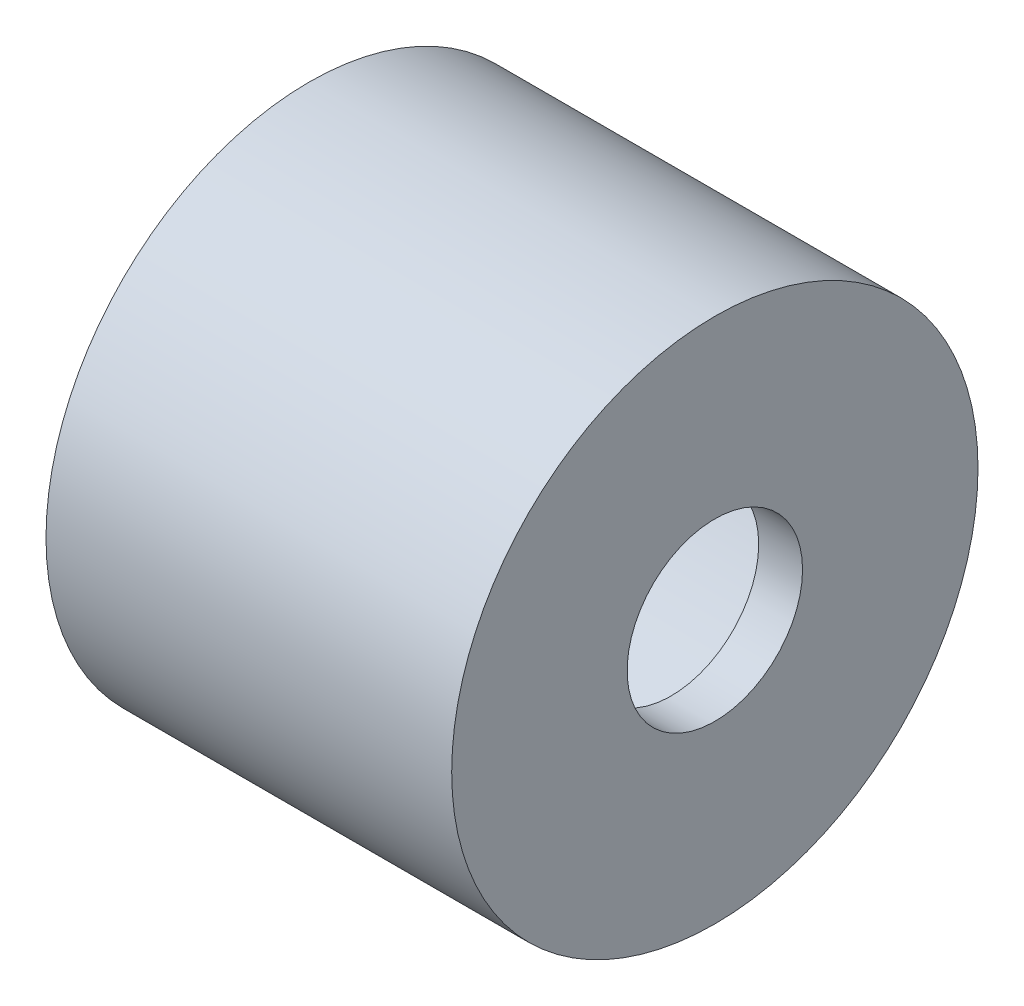
ISO-10303-21;
HEADER;
FILE_DESCRIPTION(('STEP AP214'),'2;1');
FILE_NAME('part.step','',(''),(''),'','','');
FILE_SCHEMA(('AUTOMOTIVE_DESIGN { 1 0 10303 214 1 1 1 1 }'));
ENDSEC;
DATA;
#1=APPLICATION_CONTEXT('core data for automotive mechanical design processes');
#2=APPLICATION_PROTOCOL_DEFINITION('international standard','automotive_design',2000,#1);
#3=PRODUCT_CONTEXT('',#1,'mechanical');
#4=PRODUCT('Part','Part','',(#3));
#5=PRODUCT_RELATED_PRODUCT_CATEGORY('part','',(#4));
#6=PRODUCT_DEFINITION_FORMATION('','',#4);
#7=PRODUCT_DEFINITION_CONTEXT('part definition',#1,'design');
#8=PRODUCT_DEFINITION('design','',#6,#7);
#9=PRODUCT_DEFINITION_SHAPE('','',#8);
#10=(LENGTH_UNIT() NAMED_UNIT(*) SI_UNIT(.MILLI.,.METRE.));
#11=(NAMED_UNIT(*) PLANE_ANGLE_UNIT() SI_UNIT($,.RADIAN.));
#12=(NAMED_UNIT(*) SI_UNIT($,.STERADIAN.) SOLID_ANGLE_UNIT());
#13=UNCERTAINTY_MEASURE_WITH_UNIT(LENGTH_MEASURE(1.E-05),#10,'distance_accuracy_value','');
#14=(GEOMETRIC_REPRESENTATION_CONTEXT(3) GLOBAL_UNCERTAINTY_ASSIGNED_CONTEXT((#13)) GLOBAL_UNIT_ASSIGNED_CONTEXT((#10,
#11,#12)) REPRESENTATION_CONTEXT('',''));
#15=CARTESIAN_POINT('',(0.,0.,0.));
#16=DIRECTION('',(0.,0.,1.));
#17=DIRECTION('',(1.,0.,0.));
#18=AXIS2_PLACEMENT_3D('',#15,#16,#17);
#19=CARTESIAN_POINT('',(-127.,0.,0.));
#20=DIRECTION('',(-1.,0.,0.));
#21=DIRECTION('',(0.,0.,1.));
#22=AXIS2_PLACEMENT_3D('',#19,#20,#21);
#23=PLANE('',#22);
#24=CARTESIAN_POINT('',(-127.,0.,0.));
#25=DIRECTION('',(-1.,0.,0.));
#26=DIRECTION('',(0.,0.,1.));
#27=AXIS2_PLACEMENT_3D('',#24,#25,#26);
#28=CIRCLE('',#27,139.7);
#29=CARTESIAN_POINT('',(-127.,0.,139.7));
#30=VERTEX_POINT('',#29);
#31=EDGE_CURVE('E113',#30,#30,#28,.T.);
#32=ORIENTED_EDGE('',*,*,#31,.F.);
#33=EDGE_LOOP('',(#32));
#34=FACE_BOUND('',#33,.T.);
#35=DIRECTION('',(0.,-1.,0.));
#36=VECTOR('',#35,1.);
#37=CARTESIAN_POINT('',(-127.,0.,19.05));
#38=LINE('',#37,#36);
#39=CARTESIAN_POINT('',(-127.,88.9,19.05));
#40=VERTEX_POINT('',#39);
#41=CARTESIAN_POINT('',(-127.,-88.9,19.05));
#42=VERTEX_POINT('',#41);
#43=EDGE_CURVE('E74',#40,#42,#38,.T.);
#44=ORIENTED_EDGE('',*,*,#43,.F.);
#45=CARTESIAN_POINT('',(-127.,88.9,-6.35000000000008));
#46=DIRECTION('',(-1.,0.,0.));
#47=DIRECTION('',(0.,0.,1.));
#48=AXIS2_PLACEMENT_3D('',#45,#46,#47);
#49=CIRCLE('',#48,25.4);
#50=CARTESIAN_POINT('',(-127.,88.9,-31.7500000000001));
#51=VERTEX_POINT('',#50);
#52=EDGE_CURVE('E96',#40,#51,#49,.T.);
#53=ORIENTED_EDGE('',*,*,#52,.T.);
#54=DIRECTION('',(0.,-1.,0.));
#55=VECTOR('',#54,1.);
#56=CARTESIAN_POINT('',(-127.,0.,-31.7500000000001));
#57=LINE('',#56,#55);
#58=CARTESIAN_POINT('',(-127.,-88.9,-31.7500000000001));
#59=VERTEX_POINT('',#58);
#60=EDGE_CURVE('E50',#51,#59,#57,.T.);
#61=ORIENTED_EDGE('',*,*,#60,.T.);
#62=CARTESIAN_POINT('',(-127.,-88.9,-6.35000000000001));
#63=DIRECTION('',(-1.,0.,0.));
#64=DIRECTION('',(0.,0.,1.));
#65=AXIS2_PLACEMENT_3D('',#62,#63,#64);
#66=CIRCLE('',#65,25.4);
#67=EDGE_CURVE('E84',#59,#42,#66,.T.);
#68=ORIENTED_EDGE('',*,*,#67,.T.);
#69=EDGE_LOOP('',(#44,#53,#61,#68));
#70=FACE_BOUND('',#69,.T.);
#71=ADVANCED_FACE('F35',(#34,#70),#23,.F.);
#72=CARTESIAN_POINT('',(-133.35,0.,0.));
#73=DIRECTION('',(-1.,0.,0.));
#74=DIRECTION('',(0.,0.,1.));
#75=AXIS2_PLACEMENT_3D('',#72,#73,#74);
#76=PLANE('',#75);
#77=CARTESIAN_POINT('',(-133.35,0.,0.));
#78=DIRECTION('',(-1.,0.,0.));
#79=DIRECTION('',(0.,0.,1.));
#80=AXIS2_PLACEMENT_3D('',#77,#78,#79);
#81=CIRCLE('',#80,152.4);
#82=CARTESIAN_POINT('',(-133.35,0.,152.4));
#83=VERTEX_POINT('',#82);
#84=EDGE_CURVE('E92',#83,#83,#81,.T.);
#85=ORIENTED_EDGE('',*,*,#84,.T.);
#86=EDGE_LOOP('',(#85));
#87=FACE_BOUND('',#86,.T.);
#88=CARTESIAN_POINT('',(-133.35,88.9,-6.35000000000008));
#89=DIRECTION('',(-1.,0.,0.));
#90=DIRECTION('',(0.,0.,1.));
#91=AXIS2_PLACEMENT_3D('',#88,#89,#90);
#92=CIRCLE('',#91,25.4);
#93=CARTESIAN_POINT('',(-133.35,88.9,19.05));
#94=VERTEX_POINT('',#93);
#95=CARTESIAN_POINT('',(-133.35,88.9,-31.7500000000001));
#96=VERTEX_POINT('',#95);
#97=EDGE_CURVE('E85',#94,#96,#92,.T.);
#98=ORIENTED_EDGE('',*,*,#97,.F.);
#99=DIRECTION('',(0.,-1.,0.));
#100=VECTOR('',#99,1.);
#101=CARTESIAN_POINT('',(-133.35,0.,19.05));
#102=LINE('',#101,#100);
#103=CARTESIAN_POINT('',(-133.35,-88.9,19.05));
#104=VERTEX_POINT('',#103);
#105=EDGE_CURVE('E58',#94,#104,#102,.T.);
#106=ORIENTED_EDGE('',*,*,#105,.T.);
#107=CARTESIAN_POINT('',(-133.35,-88.9,-6.35000000000001));
#108=DIRECTION('',(-1.,0.,0.));
#109=DIRECTION('',(0.,0.,1.));
#110=AXIS2_PLACEMENT_3D('',#107,#108,#109);
#111=CIRCLE('',#110,25.4);
#112=CARTESIAN_POINT('',(-133.35,-88.9,-31.7500000000001));
#113=VERTEX_POINT('',#112);
#114=EDGE_CURVE('E91',#113,#104,#111,.T.);
#115=ORIENTED_EDGE('',*,*,#114,.F.);
#116=DIRECTION('',(0.,-1.,0.));
#117=VECTOR('',#116,1.);
#118=CARTESIAN_POINT('',(-133.35,0.,-31.7500000000001));
#119=LINE('',#118,#117);
#120=EDGE_CURVE('E102',#96,#113,#119,.T.);
#121=ORIENTED_EDGE('',*,*,#120,.F.);
#122=EDGE_LOOP('',(#98,#106,#115,#121));
#123=FACE_BOUND('',#122,.T.);
#124=ADVANCED_FACE('F140',(#87,#123),#76,.T.);
#125=CARTESIAN_POINT('',(101.6,0.,0.));
#126=DIRECTION('',(1.,0.,0.));
#127=DIRECTION('',(0.,0.,-1.));
#128=AXIS2_PLACEMENT_3D('',#125,#126,#127);
#129=PLANE('',#128);
#130=CARTESIAN_POINT('',(101.6,0.,0.));
#131=DIRECTION('',(1.,0.,0.));
#132=DIRECTION('',(0.,0.,-1.));
#133=AXIS2_PLACEMENT_3D('',#130,#131,#132);
#134=CIRCLE('',#133,152.4);
#135=CARTESIAN_POINT('',(101.6,0.,-152.4));
#136=VERTEX_POINT('',#135);
#137=EDGE_CURVE('E11',#136,#136,#134,.T.);
#138=ORIENTED_EDGE('',*,*,#137,.T.);
#139=EDGE_LOOP('',(#138));
#140=FACE_BOUND('',#139,.T.);
#141=CARTESIAN_POINT('',(101.6,0.,0.));
#142=DIRECTION('',(1.,0.,0.));
#143=DIRECTION('',(0.,0.,-1.));
#144=AXIS2_PLACEMENT_3D('',#141,#142,#143);
#145=CIRCLE('',#144,50.8);
#146=CARTESIAN_POINT('',(101.6,0.,-50.8));
#147=VERTEX_POINT('',#146);
#148=EDGE_CURVE('E43',#147,#147,#145,.T.);
#149=ORIENTED_EDGE('',*,*,#148,.F.);
#150=EDGE_LOOP('',(#149));
#151=FACE_BOUND('',#150,.T.);
#152=ADVANCED_FACE('F146',(#140,#151),#129,.T.);
#153=CARTESIAN_POINT('',(76.2,0.,0.));
#154=DIRECTION('',(1.,0.,0.));
#155=DIRECTION('',(0.,0.,-1.));
#156=AXIS2_PLACEMENT_3D('',#153,#154,#155);
#157=PLANE('',#156);
#158=CARTESIAN_POINT('',(76.2,0.,0.));
#159=DIRECTION('',(-1.,0.,0.));
#160=DIRECTION('',(0.,0.,1.));
#161=AXIS2_PLACEMENT_3D('',#158,#159,#160);
#162=CIRCLE('',#161,139.7);
#163=CARTESIAN_POINT('',(76.2,0.,139.7));
#164=VERTEX_POINT('',#163);
#165=EDGE_CURVE('E116',#164,#164,#162,.T.);
#166=ORIENTED_EDGE('',*,*,#165,.T.);
#167=EDGE_LOOP('',(#166));
#168=FACE_BOUND('',#167,.T.);
#169=CARTESIAN_POINT('',(76.2,0.,0.));
#170=DIRECTION('',(1.,0.,0.));
#171=DIRECTION('',(0.,0.,-1.));
#172=AXIS2_PLACEMENT_3D('',#169,#170,#171);
#173=CIRCLE('',#172,50.8);
#174=CARTESIAN_POINT('',(76.2,0.,-50.8));
#175=VERTEX_POINT('',#174);
#176=EDGE_CURVE('E119',#175,#175,#173,.T.);
#177=ORIENTED_EDGE('',*,*,#176,.T.);
#178=EDGE_LOOP('',(#177));
#179=FACE_BOUND('',#178,.T.);
#180=ADVANCED_FACE('F124',(#168,#179),#157,.F.);
#181=CARTESIAN_POINT('',(101.6,0.,0.));
#182=DIRECTION('',(-1.,0.,0.));
#183=DIRECTION('',(0.,0.,1.));
#184=AXIS2_PLACEMENT_3D('',#181,#182,#183);
#185=CYLINDRICAL_SURFACE('',#184,152.4);
#186=ORIENTED_EDGE('',*,*,#137,.F.);
#187=EDGE_LOOP('',(#186));
#188=FACE_BOUND('',#187,.T.);
#189=ORIENTED_EDGE('',*,*,#84,.F.);
#190=EDGE_LOOP('',(#189));
#191=FACE_BOUND('',#190,.T.);
#192=ADVANCED_FACE('F37',(#188,#191),#185,.T.);
#193=CARTESIAN_POINT('',(101.6,0.,0.));
#194=DIRECTION('',(-1.,0.,0.));
#195=DIRECTION('',(0.,0.,1.));
#196=AXIS2_PLACEMENT_3D('',#193,#194,#195);
#197=CYLINDRICAL_SURFACE('',#196,50.8);
#198=ORIENTED_EDGE('',*,*,#148,.T.);
#199=EDGE_LOOP('',(#198));
#200=FACE_BOUND('',#199,.T.);
#201=ORIENTED_EDGE('',*,*,#176,.F.);
#202=EDGE_LOOP('',(#201));
#203=FACE_BOUND('',#202,.T.);
#204=ADVANCED_FACE('F126',(#200,#203),#197,.F.);
#205=CARTESIAN_POINT('',(-127.,0.,0.));
#206=DIRECTION('',(1.,0.,0.));
#207=DIRECTION('',(0.,0.,-1.));
#208=AXIS2_PLACEMENT_3D('',#205,#206,#207);
#209=CYLINDRICAL_SURFACE('',#208,139.7);
#210=ORIENTED_EDGE('',*,*,#31,.T.);
#211=EDGE_LOOP('',(#210));
#212=FACE_BOUND('',#211,.T.);
#213=ORIENTED_EDGE('',*,*,#165,.F.);
#214=EDGE_LOOP('',(#213));
#215=FACE_BOUND('',#214,.T.);
#216=ADVANCED_FACE('F128',(#212,#215),#209,.F.);
#217=CARTESIAN_POINT('',(-127.,0.,19.05));
#218=DIRECTION('',(0.,0.,-1.));
#219=DIRECTION('',(0.,1.,0.));
#220=AXIS2_PLACEMENT_3D('',#217,#218,#219);
#221=PLANE('',#220);
#222=ORIENTED_EDGE('',*,*,#105,.F.);
#223=DIRECTION('',(-1.,0.,0.));
#224=VECTOR('',#223,1.);
#225=CARTESIAN_POINT('',(-127.,88.9,19.05));
#226=LINE('',#225,#224);
#227=EDGE_CURVE('E79',#40,#94,#226,.T.);
#228=ORIENTED_EDGE('',*,*,#227,.F.);
#229=ORIENTED_EDGE('',*,*,#43,.T.);
#230=DIRECTION('',(-1.,0.,0.));
#231=VECTOR('',#230,1.);
#232=CARTESIAN_POINT('',(-127.,-88.9,19.05));
#233=LINE('',#232,#231);
#234=EDGE_CURVE('E77',#42,#104,#233,.T.);
#235=ORIENTED_EDGE('',*,*,#234,.T.);
#236=EDGE_LOOP('',(#222,#228,#229,#235));
#237=FACE_BOUND('',#236,.T.);
#238=ADVANCED_FACE('F76',(#237),#221,.T.);
#239=CARTESIAN_POINT('',(-127.,-88.9,-6.35000000000001));
#240=DIRECTION('',(-1.,0.,0.));
#241=DIRECTION('',(0.,0.,1.));
#242=AXIS2_PLACEMENT_3D('',#239,#240,#241);
#243=CYLINDRICAL_SURFACE('',#242,25.4);
#244=ORIENTED_EDGE('',*,*,#114,.T.);
#245=ORIENTED_EDGE('',*,*,#234,.F.);
#246=ORIENTED_EDGE('',*,*,#67,.F.);
#247=DIRECTION('',(-1.,0.,0.));
#248=VECTOR('',#247,1.);
#249=CARTESIAN_POINT('',(-127.,-88.9,-31.7500000000001));
#250=LINE('',#249,#248);
#251=EDGE_CURVE('E93',#59,#113,#250,.T.);
#252=ORIENTED_EDGE('',*,*,#251,.T.);
#253=EDGE_LOOP('',(#244,#245,#246,#252));
#254=FACE_BOUND('',#253,.T.);
#255=ADVANCED_FACE('F89',(#254),#243,.F.);
#256=CARTESIAN_POINT('',(-127.,0.,-31.7500000000001));
#257=DIRECTION('',(0.,0.,-1.));
#258=DIRECTION('',(0.,1.,0.));
#259=AXIS2_PLACEMENT_3D('',#256,#257,#258);
#260=PLANE('',#259);
#261=ORIENTED_EDGE('',*,*,#120,.T.);
#262=ORIENTED_EDGE('',*,*,#251,.F.);
#263=ORIENTED_EDGE('',*,*,#60,.F.);
#264=DIRECTION('',(-1.,0.,0.));
#265=VECTOR('',#264,1.);
#266=CARTESIAN_POINT('',(-127.,88.9,-31.7500000000001));
#267=LINE('',#266,#265);
#268=EDGE_CURVE('E108',#51,#96,#267,.T.);
#269=ORIENTED_EDGE('',*,*,#268,.T.);
#270=EDGE_LOOP('',(#261,#262,#263,#269));
#271=FACE_BOUND('',#270,.T.);
#272=ADVANCED_FACE('F155',(#271),#260,.F.);
#273=CARTESIAN_POINT('',(-127.,88.9,-6.35000000000008));
#274=DIRECTION('',(-1.,0.,0.));
#275=DIRECTION('',(0.,0.,1.));
#276=AXIS2_PLACEMENT_3D('',#273,#274,#275);
#277=CYLINDRICAL_SURFACE('',#276,25.4);
#278=ORIENTED_EDGE('',*,*,#97,.T.);
#279=ORIENTED_EDGE('',*,*,#268,.F.);
#280=ORIENTED_EDGE('',*,*,#52,.F.);
#281=ORIENTED_EDGE('',*,*,#227,.T.);
#282=EDGE_LOOP('',(#278,#279,#280,#281));
#283=FACE_BOUND('',#282,.T.);
#284=ADVANCED_FACE('F158',(#283),#277,.F.);
#285=CLOSED_SHELL('',(#71,#124,#152,#180,#192,#204,#216,#238,#255,#272,#284));
#286=MANIFOLD_SOLID_BREP('B2',#285);
#287=ADVANCED_BREP_SHAPE_REPRESENTATION('',(#18,#286),#14);
#288=SHAPE_DEFINITION_REPRESENTATION(#9,#287);
ENDSEC;
END-ISO-10303-21;
